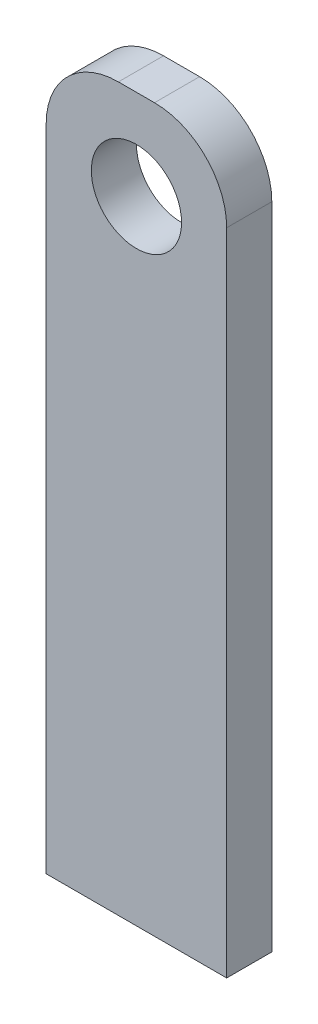
ISO-10303-21;
HEADER;
FILE_DESCRIPTION(('STEP AP214'),'2;1');
FILE_NAME('part.step','',(''),(''),'','','');
FILE_SCHEMA(('AUTOMOTIVE_DESIGN { 1 0 10303 214 1 1 1 1 }'));
ENDSEC;
DATA;
#1=APPLICATION_CONTEXT('core data for automotive mechanical design processes');
#2=APPLICATION_PROTOCOL_DEFINITION('international standard','automotive_design',2000,#1);
#3=PRODUCT_CONTEXT('',#1,'mechanical');
#4=PRODUCT('Part','Part','',(#3));
#5=PRODUCT_RELATED_PRODUCT_CATEGORY('part','',(#4));
#6=PRODUCT_DEFINITION_FORMATION('','',#4);
#7=PRODUCT_DEFINITION_CONTEXT('part definition',#1,'design');
#8=PRODUCT_DEFINITION('design','',#6,#7);
#9=PRODUCT_DEFINITION_SHAPE('','',#8);
#10=(LENGTH_UNIT() NAMED_UNIT(*) SI_UNIT(.MILLI.,.METRE.));
#11=(NAMED_UNIT(*) PLANE_ANGLE_UNIT() SI_UNIT($,.RADIAN.));
#12=(NAMED_UNIT(*) SI_UNIT($,.STERADIAN.) SOLID_ANGLE_UNIT());
#13=UNCERTAINTY_MEASURE_WITH_UNIT(LENGTH_MEASURE(1.E-05),#10,'distance_accuracy_value','');
#14=(GEOMETRIC_REPRESENTATION_CONTEXT(3) GLOBAL_UNCERTAINTY_ASSIGNED_CONTEXT((#13)) GLOBAL_UNIT_ASSIGNED_CONTEXT((#10,
#11,#12)) REPRESENTATION_CONTEXT('',''));
#15=CARTESIAN_POINT('',(0.,0.,0.));
#16=DIRECTION('',(0.,0.,1.));
#17=DIRECTION('',(1.,0.,0.));
#18=AXIS2_PLACEMENT_3D('',#15,#16,#17);
#19=CARTESIAN_POINT('',(6.35,-25.4,3.175));
#20=DIRECTION('',(-1.,0.,0.));
#21=DIRECTION('',(0.,0.,1.));
#22=AXIS2_PLACEMENT_3D('',#19,#20,#21);
#23=PLANE('',#22);
#24=DIRECTION('',(0.,1.,0.));
#25=VECTOR('',#24,1.);
#26=CARTESIAN_POINT('',(6.35,-25.4,0.));
#27=LINE('',#26,#25);
#28=CARTESIAN_POINT('',(6.35,-25.4,0.));
#29=VERTEX_POINT('',#28);
#30=CARTESIAN_POINT('',(6.35,20.32,0.));
#31=VERTEX_POINT('',#30);
#32=EDGE_CURVE('E118',#29,#31,#27,.T.);
#33=ORIENTED_EDGE('',*,*,#32,.T.);
#34=DIRECTION('',(0.,0.,-1.));
#35=VECTOR('',#34,1.);
#36=CARTESIAN_POINT('',(6.35,20.32,3.175));
#37=LINE('',#36,#35);
#38=CARTESIAN_POINT('',(6.35,20.32,3.175));
#39=VERTEX_POINT('',#38);
#40=EDGE_CURVE('E61',#31,#39,#37,.F.);
#41=ORIENTED_EDGE('',*,*,#40,.T.);
#42=DIRECTION('',(0.,1.,0.));
#43=VECTOR('',#42,1.);
#44=CARTESIAN_POINT('',(6.35,-25.4,3.175));
#45=LINE('',#44,#43);
#46=CARTESIAN_POINT('',(6.35,-25.4,3.175));
#47=VERTEX_POINT('',#46);
#48=EDGE_CURVE('E128',#47,#39,#45,.T.);
#49=ORIENTED_EDGE('',*,*,#48,.F.);
#50=DIRECTION('',(0.,0.,-1.));
#51=VECTOR('',#50,1.);
#52=CARTESIAN_POINT('',(6.35,-25.4,3.175));
#53=LINE('',#52,#51);
#54=EDGE_CURVE('E110',#47,#29,#53,.T.);
#55=ORIENTED_EDGE('',*,*,#54,.T.);
#56=EDGE_LOOP('',(#33,#41,#49,#55));
#57=FACE_BOUND('',#56,.T.);
#58=ADVANCED_FACE('F38',(#57),#23,.F.);
#59=CARTESIAN_POINT('',(-6.35,25.4,3.175));
#60=DIRECTION('',(0.,-1.,0.));
#61=DIRECTION('',(0.,0.,-1.));
#62=AXIS2_PLACEMENT_3D('',#59,#60,#61);
#63=PLANE('',#62);
#64=DIRECTION('',(-1.,0.,0.));
#65=VECTOR('',#64,1.);
#66=CARTESIAN_POINT('',(-6.35,25.4,3.175));
#67=LINE('',#66,#65);
#68=CARTESIAN_POINT('',(1.27,25.4,3.175));
#69=VERTEX_POINT('',#68);
#70=CARTESIAN_POINT('',(-1.27,25.4,3.175));
#71=VERTEX_POINT('',#70);
#72=EDGE_CURVE('E100',#69,#71,#67,.T.);
#73=ORIENTED_EDGE('',*,*,#72,.F.);
#74=DIRECTION('',(0.,0.,-1.));
#75=VECTOR('',#74,1.);
#76=CARTESIAN_POINT('',(1.27,25.4,3.175));
#77=LINE('',#76,#75);
#78=CARTESIAN_POINT('',(1.27,25.4,0.));
#79=VERTEX_POINT('',#78);
#80=EDGE_CURVE('E131',#69,#79,#77,.T.);
#81=ORIENTED_EDGE('',*,*,#80,.T.);
#82=DIRECTION('',(-1.,0.,0.));
#83=VECTOR('',#82,1.);
#84=CARTESIAN_POINT('',(-6.35,25.4,0.));
#85=LINE('',#84,#83);
#86=CARTESIAN_POINT('',(-1.27,25.4,0.));
#87=VERTEX_POINT('',#86);
#88=EDGE_CURVE('E121',#79,#87,#85,.T.);
#89=ORIENTED_EDGE('',*,*,#88,.T.);
#90=DIRECTION('',(0.,0.,-1.));
#91=VECTOR('',#90,1.);
#92=CARTESIAN_POINT('',(-1.27,25.4,3.175));
#93=LINE('',#92,#91);
#94=EDGE_CURVE('E109',#87,#71,#93,.F.);
#95=ORIENTED_EDGE('',*,*,#94,.T.);
#96=EDGE_LOOP('',(#73,#81,#89,#95));
#97=FACE_BOUND('',#96,.T.);
#98=ADVANCED_FACE('F144',(#97),#63,.F.);
#99=CARTESIAN_POINT('',(-6.35,-25.4,3.175));
#100=DIRECTION('',(1.,0.,0.));
#101=DIRECTION('',(0.,0.,-1.));
#102=AXIS2_PLACEMENT_3D('',#99,#100,#101);
#103=PLANE('',#102);
#104=DIRECTION('',(0.,-1.,0.));
#105=VECTOR('',#104,1.);
#106=CARTESIAN_POINT('',(-6.35,-25.4,3.175));
#107=LINE('',#106,#105);
#108=CARTESIAN_POINT('',(-6.35,20.32,3.175));
#109=VERTEX_POINT('',#108);
#110=CARTESIAN_POINT('',(-6.35,-25.4,3.175));
#111=VERTEX_POINT('',#110);
#112=EDGE_CURVE('E91',#109,#111,#107,.T.);
#113=ORIENTED_EDGE('',*,*,#112,.F.);
#114=DIRECTION('',(0.,0.,-1.));
#115=VECTOR('',#114,1.);
#116=CARTESIAN_POINT('',(-6.35,20.32,3.175));
#117=LINE('',#116,#115);
#118=CARTESIAN_POINT('',(-6.35,20.32,0.));
#119=VERTEX_POINT('',#118);
#120=EDGE_CURVE('E11',#109,#119,#117,.T.);
#121=ORIENTED_EDGE('',*,*,#120,.T.);
#122=DIRECTION('',(0.,-1.,0.));
#123=VECTOR('',#122,1.);
#124=CARTESIAN_POINT('',(-6.35,-25.4,0.));
#125=LINE('',#124,#123);
#126=CARTESIAN_POINT('',(-6.35,-25.4,0.));
#127=VERTEX_POINT('',#126);
#128=EDGE_CURVE('E106',#119,#127,#125,.T.);
#129=ORIENTED_EDGE('',*,*,#128,.T.);
#130=DIRECTION('',(0.,0.,-1.));
#131=VECTOR('',#130,1.);
#132=CARTESIAN_POINT('',(-6.35,-25.4,3.175));
#133=LINE('',#132,#131);
#134=EDGE_CURVE('E103',#111,#127,#133,.T.);
#135=ORIENTED_EDGE('',*,*,#134,.F.);
#136=EDGE_LOOP('',(#113,#121,#129,#135));
#137=FACE_BOUND('',#136,.T.);
#138=ADVANCED_FACE('F104',(#137),#103,.F.);
#139=CARTESIAN_POINT('',(-6.35,-25.4,3.175));
#140=DIRECTION('',(0.,1.,0.));
#141=DIRECTION('',(0.,0.,1.));
#142=AXIS2_PLACEMENT_3D('',#139,#140,#141);
#143=PLANE('',#142);
#144=DIRECTION('',(1.,0.,0.));
#145=VECTOR('',#144,1.);
#146=CARTESIAN_POINT('',(-6.35,-25.4,0.));
#147=LINE('',#146,#145);
#148=EDGE_CURVE('E127',#127,#29,#147,.T.);
#149=ORIENTED_EDGE('',*,*,#148,.T.);
#150=ORIENTED_EDGE('',*,*,#54,.F.);
#151=DIRECTION('',(1.,0.,0.));
#152=VECTOR('',#151,1.);
#153=CARTESIAN_POINT('',(-6.35,-25.4,3.175));
#154=LINE('',#153,#152);
#155=EDGE_CURVE('E95',#111,#47,#154,.T.);
#156=ORIENTED_EDGE('',*,*,#155,.F.);
#157=ORIENTED_EDGE('',*,*,#134,.T.);
#158=EDGE_LOOP('',(#149,#150,#156,#157));
#159=FACE_BOUND('',#158,.T.);
#160=ADVANCED_FACE('F112',(#159),#143,.F.);
#161=CARTESIAN_POINT('',(6.35,25.4,3.175));
#162=DIRECTION('',(0.,0.,-1.));
#163=DIRECTION('',(-1.,0.,0.));
#164=AXIS2_PLACEMENT_3D('',#161,#162,#163);
#165=PLANE('',#164);
#166=CARTESIAN_POINT('',(0.,19.05,3.175));
#167=DIRECTION('',(0.,0.,1.));
#168=DIRECTION('',(1.,0.,0.));
#169=AXIS2_PLACEMENT_3D('',#166,#167,#168);
#170=CIRCLE('',#169,3.17499999999999);
#171=CARTESIAN_POINT('',(3.17499999999999,19.05,3.175));
#172=VERTEX_POINT('',#171);
#173=EDGE_CURVE('E156',#172,#172,#170,.T.);
#174=ORIENTED_EDGE('',*,*,#173,.F.);
#175=EDGE_LOOP('',(#174));
#176=FACE_BOUND('',#175,.T.);
#177=ORIENTED_EDGE('',*,*,#48,.T.);
#178=CARTESIAN_POINT('',(1.27,20.32,3.175));
#179=DIRECTION('',(0.,0.,-1.));
#180=DIRECTION('',(-1.,0.,0.));
#181=AXIS2_PLACEMENT_3D('',#178,#179,#180);
#182=CIRCLE('',#181,5.08);
#183=EDGE_CURVE('E46',#39,#69,#182,.F.);
#184=ORIENTED_EDGE('',*,*,#183,.T.);
#185=ORIENTED_EDGE('',*,*,#72,.T.);
#186=CARTESIAN_POINT('',(-1.27,20.32,3.175));
#187=DIRECTION('',(0.,0.,-1.));
#188=DIRECTION('',(-1.,0.,0.));
#189=AXIS2_PLACEMENT_3D('',#186,#187,#188);
#190=CIRCLE('',#189,5.08);
#191=EDGE_CURVE('E53',#71,#109,#190,.F.);
#192=ORIENTED_EDGE('',*,*,#191,.T.);
#193=ORIENTED_EDGE('',*,*,#112,.T.);
#194=ORIENTED_EDGE('',*,*,#155,.T.);
#195=EDGE_LOOP('',(#177,#184,#185,#192,#193,#194));
#196=FACE_BOUND('',#195,.T.);
#197=ADVANCED_FACE('F93',(#176,#196),#165,.F.);
#198=CARTESIAN_POINT('',(6.35,25.4,0.));
#199=DIRECTION('',(0.,0.,-1.));
#200=DIRECTION('',(-1.,0.,0.));
#201=AXIS2_PLACEMENT_3D('',#198,#199,#200);
#202=PLANE('',#201);
#203=CARTESIAN_POINT('',(0.,19.05,0.));
#204=DIRECTION('',(0.,0.,-1.));
#205=DIRECTION('',(-1.,0.,0.));
#206=AXIS2_PLACEMENT_3D('',#203,#204,#205);
#207=CIRCLE('',#206,3.17499999999999);
#208=CARTESIAN_POINT('',(-3.17499999999999,19.05,0.));
#209=VERTEX_POINT('',#208);
#210=EDGE_CURVE('E122',#209,#209,#207,.T.);
#211=ORIENTED_EDGE('',*,*,#210,.F.);
#212=EDGE_LOOP('',(#211));
#213=FACE_BOUND('',#212,.T.);
#214=ORIENTED_EDGE('',*,*,#88,.F.);
#215=CARTESIAN_POINT('',(1.27,20.32,0.));
#216=DIRECTION('',(0.,0.,-1.));
#217=DIRECTION('',(-1.,0.,0.));
#218=AXIS2_PLACEMENT_3D('',#215,#216,#217);
#219=CIRCLE('',#218,5.08);
#220=EDGE_CURVE('E136',#79,#31,#219,.T.);
#221=ORIENTED_EDGE('',*,*,#220,.T.);
#222=ORIENTED_EDGE('',*,*,#32,.F.);
#223=ORIENTED_EDGE('',*,*,#148,.F.);
#224=ORIENTED_EDGE('',*,*,#128,.F.);
#225=CARTESIAN_POINT('',(-1.27,20.32,0.));
#226=DIRECTION('',(0.,0.,-1.));
#227=DIRECTION('',(-1.,0.,0.));
#228=AXIS2_PLACEMENT_3D('',#225,#226,#227);
#229=CIRCLE('',#228,5.08);
#230=EDGE_CURVE('E134',#119,#87,#229,.T.);
#231=ORIENTED_EDGE('',*,*,#230,.T.);
#232=EDGE_LOOP('',(#214,#221,#222,#223,#224,#231));
#233=FACE_BOUND('',#232,.T.);
#234=ADVANCED_FACE('F150',(#213,#233),#202,.T.);
#235=CARTESIAN_POINT('',(0.,19.05,3.175));
#236=DIRECTION('',(0.,0.,1.));
#237=DIRECTION('',(1.,0.,0.));
#238=AXIS2_PLACEMENT_3D('',#235,#236,#237);
#239=CYLINDRICAL_SURFACE('',#238,3.17499999999999);
#240=ORIENTED_EDGE('',*,*,#210,.T.);
#241=EDGE_LOOP('',(#240));
#242=FACE_BOUND('',#241,.T.);
#243=ORIENTED_EDGE('',*,*,#173,.T.);
#244=EDGE_LOOP('',(#243));
#245=FACE_BOUND('',#244,.T.);
#246=ADVANCED_FACE('F160',(#242,#245),#239,.F.);
#247=CARTESIAN_POINT('',(1.27,20.32,3.175));
#248=DIRECTION('',(0.,0.,-1.));
#249=DIRECTION('',(-1.,0.,0.));
#250=AXIS2_PLACEMENT_3D('',#247,#248,#249);
#251=CYLINDRICAL_SURFACE('',#250,5.08);
#252=ORIENTED_EDGE('',*,*,#183,.F.);
#253=ORIENTED_EDGE('',*,*,#40,.F.);
#254=ORIENTED_EDGE('',*,*,#220,.F.);
#255=ORIENTED_EDGE('',*,*,#80,.F.);
#256=EDGE_LOOP('',(#252,#253,#254,#255));
#257=FACE_BOUND('',#256,.T.);
#258=ADVANCED_FACE('F147',(#257),#251,.T.);
#259=CARTESIAN_POINT('',(-1.27,20.32,3.175));
#260=DIRECTION('',(0.,0.,-1.));
#261=DIRECTION('',(-1.,0.,0.));
#262=AXIS2_PLACEMENT_3D('',#259,#260,#261);
#263=CYLINDRICAL_SURFACE('',#262,5.08);
#264=ORIENTED_EDGE('',*,*,#191,.F.);
#265=ORIENTED_EDGE('',*,*,#94,.F.);
#266=ORIENTED_EDGE('',*,*,#230,.F.);
#267=ORIENTED_EDGE('',*,*,#120,.F.);
#268=EDGE_LOOP('',(#264,#265,#266,#267));
#269=FACE_BOUND('',#268,.T.);
#270=ADVANCED_FACE('F40',(#269),#263,.T.);
#271=CLOSED_SHELL('',(#58,#98,#138,#160,#197,#234,#246,#258,#270));
#272=MANIFOLD_SOLID_BREP('B2',#271);
#273=ADVANCED_BREP_SHAPE_REPRESENTATION('',(#18,#272),#14);
#274=SHAPE_DEFINITION_REPRESENTATION(#9,#273);
ENDSEC;
END-ISO-10303-21;
